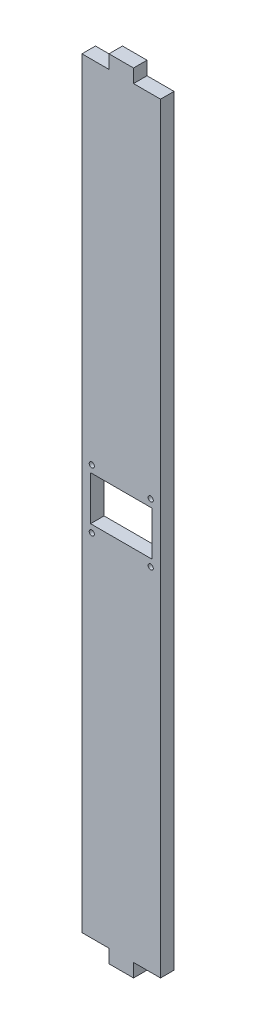
ISO-10303-21;
HEADER;
FILE_DESCRIPTION(('STEP AP214'),'2;1');
FILE_NAME('part.step','',(''),(''),'','','');
FILE_SCHEMA(('AUTOMOTIVE_DESIGN { 1 0 10303 214 1 1 1 1 }'));
ENDSEC;
DATA;
#1=APPLICATION_CONTEXT('core data for automotive mechanical design processes');
#2=APPLICATION_PROTOCOL_DEFINITION('international standard','automotive_design',2000,#1);
#3=PRODUCT_CONTEXT('',#1,'mechanical');
#4=PRODUCT('Part','Part','',(#3));
#5=PRODUCT_RELATED_PRODUCT_CATEGORY('part','',(#4));
#6=PRODUCT_DEFINITION_FORMATION('','',#4);
#7=PRODUCT_DEFINITION_CONTEXT('part definition',#1,'design');
#8=PRODUCT_DEFINITION('design','',#6,#7);
#9=PRODUCT_DEFINITION_SHAPE('','',#8);
#10=(LENGTH_UNIT() NAMED_UNIT(*) SI_UNIT(.MILLI.,.METRE.));
#11=(NAMED_UNIT(*) PLANE_ANGLE_UNIT() SI_UNIT($,.RADIAN.));
#12=(NAMED_UNIT(*) SI_UNIT($,.STERADIAN.) SOLID_ANGLE_UNIT());
#13=UNCERTAINTY_MEASURE_WITH_UNIT(LENGTH_MEASURE(1.E-05),#10,'distance_accuracy_value','');
#14=(GEOMETRIC_REPRESENTATION_CONTEXT(3) GLOBAL_UNCERTAINTY_ASSIGNED_CONTEXT((#13)) GLOBAL_UNIT_ASSIGNED_CONTEXT((#10,
#11,#12)) REPRESENTATION_CONTEXT('',''));
#15=CARTESIAN_POINT('',(0.,0.,0.));
#16=DIRECTION('',(0.,0.,1.));
#17=DIRECTION('',(1.,0.,0.));
#18=AXIS2_PLACEMENT_3D('',#15,#16,#17);
#19=CARTESIAN_POINT('',(16.,160.5,5.5));
#20=DIRECTION('',(-1.,0.,0.));
#21=DIRECTION('',(0.,-1.,0.));
#22=AXIS2_PLACEMENT_3D('',#19,#20,#21);
#23=PLANE('',#22);
#24=DIRECTION('',(0.,1.,0.));
#25=VECTOR('',#24,1.);
#26=CARTESIAN_POINT('',(16.,160.5,5.5));
#27=LINE('',#26,#25);
#28=CARTESIAN_POINT('',(16.,-155.,5.5));
#29=VERTEX_POINT('',#28);
#30=CARTESIAN_POINT('',(16.,155.,5.5));
#31=VERTEX_POINT('',#30);
#32=EDGE_CURVE('E185',#29,#31,#27,.T.);
#33=ORIENTED_EDGE('',*,*,#32,.F.);
#34=DIRECTION('',(0.,0.,1.));
#35=VECTOR('',#34,1.);
#36=CARTESIAN_POINT('',(16.,-155.,0.));
#37=LINE('',#36,#35);
#38=CARTESIAN_POINT('',(16.,-155.,0.));
#39=VERTEX_POINT('',#38);
#40=EDGE_CURVE('E274',#39,#29,#37,.T.);
#41=ORIENTED_EDGE('',*,*,#40,.F.);
#42=DIRECTION('',(0.,1.,0.));
#43=VECTOR('',#42,1.);
#44=CARTESIAN_POINT('',(16.,160.5,0.));
#45=LINE('',#44,#43);
#46=CARTESIAN_POINT('',(16.,155.,0.));
#47=VERTEX_POINT('',#46);
#48=EDGE_CURVE('E175',#39,#47,#45,.T.);
#49=ORIENTED_EDGE('',*,*,#48,.T.);
#50=DIRECTION('',(0.,0.,1.));
#51=VECTOR('',#50,1.);
#52=CARTESIAN_POINT('',(16.,155.,0.));
#53=LINE('',#52,#51);
#54=EDGE_CURVE('E255',#47,#31,#53,.T.);
#55=ORIENTED_EDGE('',*,*,#54,.T.);
#56=EDGE_LOOP('',(#33,#41,#49,#55));
#57=FACE_BOUND('',#56,.T.);
#58=ADVANCED_FACE('F33',(#57),#23,.F.);
#59=CARTESIAN_POINT('',(-16.,160.5,5.5));
#60=DIRECTION('',(0.,-1.,0.));
#61=DIRECTION('',(0.,0.,-1.));
#62=AXIS2_PLACEMENT_3D('',#59,#60,#61);
#63=PLANE('',#62);
#64=DIRECTION('',(-1.,0.,0.));
#65=VECTOR('',#64,1.);
#66=CARTESIAN_POINT('',(-16.,160.5,5.5));
#67=LINE('',#66,#65);
#68=CARTESIAN_POINT('',(4.99999999999999,160.5,5.5));
#69=VERTEX_POINT('',#68);
#70=CARTESIAN_POINT('',(-5.00000000000002,160.5,5.5));
#71=VERTEX_POINT('',#70);
#72=EDGE_CURVE('E167',#69,#71,#67,.T.);
#73=ORIENTED_EDGE('',*,*,#72,.F.);
#74=DIRECTION('',(0.,0.,1.));
#75=VECTOR('',#74,1.);
#76=CARTESIAN_POINT('',(4.99999999999999,160.5,0.));
#77=LINE('',#76,#75);
#78=CARTESIAN_POINT('',(4.99999999999999,160.5,0.));
#79=VERTEX_POINT('',#78);
#80=EDGE_CURVE('E151',#79,#69,#77,.T.);
#81=ORIENTED_EDGE('',*,*,#80,.F.);
#82=DIRECTION('',(-1.,0.,0.));
#83=VECTOR('',#82,1.);
#84=CARTESIAN_POINT('',(-16.,160.5,0.));
#85=LINE('',#84,#83);
#86=CARTESIAN_POINT('',(-5.00000000000002,160.5,0.));
#87=VERTEX_POINT('',#86);
#88=EDGE_CURVE('E165',#79,#87,#85,.T.);
#89=ORIENTED_EDGE('',*,*,#88,.T.);
#90=DIRECTION('',(0.,0.,1.));
#91=VECTOR('',#90,1.);
#92=CARTESIAN_POINT('',(-5.00000000000002,160.5,0.));
#93=LINE('',#92,#91);
#94=EDGE_CURVE('E224',#87,#71,#93,.T.);
#95=ORIENTED_EDGE('',*,*,#94,.T.);
#96=EDGE_LOOP('',(#73,#81,#89,#95));
#97=FACE_BOUND('',#96,.T.);
#98=ADVANCED_FACE('F163',(#97),#63,.F.);
#99=CARTESIAN_POINT('',(-16.,160.5,5.5));
#100=DIRECTION('',(1.,0.,0.));
#101=DIRECTION('',(0.,1.,0.));
#102=AXIS2_PLACEMENT_3D('',#99,#100,#101);
#103=PLANE('',#102);
#104=DIRECTION('',(0.,-1.,0.));
#105=VECTOR('',#104,1.);
#106=CARTESIAN_POINT('',(-16.,160.5,0.));
#107=LINE('',#106,#105);
#108=CARTESIAN_POINT('',(-16.,155.,0.));
#109=VERTEX_POINT('',#108);
#110=CARTESIAN_POINT('',(-16.,-155.,0.));
#111=VERTEX_POINT('',#110);
#112=EDGE_CURVE('E174',#109,#111,#107,.T.);
#113=ORIENTED_EDGE('',*,*,#112,.T.);
#114=DIRECTION('',(0.,0.,1.));
#115=VECTOR('',#114,1.);
#116=CARTESIAN_POINT('',(-16.,-155.,0.));
#117=LINE('',#116,#115);
#118=CARTESIAN_POINT('',(-16.,-155.,5.5));
#119=VERTEX_POINT('',#118);
#120=EDGE_CURVE('E262',#111,#119,#117,.T.);
#121=ORIENTED_EDGE('',*,*,#120,.T.);
#122=DIRECTION('',(0.,-1.,0.));
#123=VECTOR('',#122,1.);
#124=CARTESIAN_POINT('',(-16.,160.5,5.5));
#125=LINE('',#124,#123);
#126=CARTESIAN_POINT('',(-16.,155.,5.5));
#127=VERTEX_POINT('',#126);
#128=EDGE_CURVE('E41',#127,#119,#125,.T.);
#129=ORIENTED_EDGE('',*,*,#128,.F.);
#130=DIRECTION('',(0.,0.,1.));
#131=VECTOR('',#130,1.);
#132=CARTESIAN_POINT('',(-16.,155.,0.));
#133=LINE('',#132,#131);
#134=EDGE_CURVE('E244',#109,#127,#133,.T.);
#135=ORIENTED_EDGE('',*,*,#134,.F.);
#136=EDGE_LOOP('',(#113,#121,#129,#135));
#137=FACE_BOUND('',#136,.T.);
#138=ADVANCED_FACE('F323',(#137),#103,.F.);
#139=CARTESIAN_POINT('',(-16.,-160.5,5.5));
#140=DIRECTION('',(0.,1.,0.));
#141=DIRECTION('',(0.,0.,1.));
#142=AXIS2_PLACEMENT_3D('',#139,#140,#141);
#143=PLANE('',#142);
#144=DIRECTION('',(1.,0.,0.));
#145=VECTOR('',#144,1.);
#146=CARTESIAN_POINT('',(-16.,-160.5,5.5));
#147=LINE('',#146,#145);
#148=CARTESIAN_POINT('',(-5.00000000000002,-160.5,5.5));
#149=VERTEX_POINT('',#148);
#150=CARTESIAN_POINT('',(4.99999999999999,-160.5,5.5));
#151=VERTEX_POINT('',#150);
#152=EDGE_CURVE('E11',#149,#151,#147,.T.);
#153=ORIENTED_EDGE('',*,*,#152,.F.);
#154=DIRECTION('',(0.,0.,1.));
#155=VECTOR('',#154,1.);
#156=CARTESIAN_POINT('',(-5.00000000000002,-160.5,0.));
#157=LINE('',#156,#155);
#158=CARTESIAN_POINT('',(-5.00000000000002,-160.5,0.));
#159=VERTEX_POINT('',#158);
#160=EDGE_CURVE('E258',#159,#149,#157,.T.);
#161=ORIENTED_EDGE('',*,*,#160,.F.);
#162=DIRECTION('',(1.,0.,0.));
#163=VECTOR('',#162,1.);
#164=CARTESIAN_POINT('',(-16.,-160.5,0.));
#165=LINE('',#164,#163);
#166=CARTESIAN_POINT('',(4.99999999999999,-160.5,0.));
#167=VERTEX_POINT('',#166);
#168=EDGE_CURVE('E36',#159,#167,#165,.T.);
#169=ORIENTED_EDGE('',*,*,#168,.T.);
#170=DIRECTION('',(0.,0.,1.));
#171=VECTOR('',#170,1.);
#172=CARTESIAN_POINT('',(4.99999999999999,-160.5,0.));
#173=LINE('',#172,#171);
#174=EDGE_CURVE('E278',#167,#151,#173,.T.);
#175=ORIENTED_EDGE('',*,*,#174,.T.);
#176=EDGE_LOOP('',(#153,#161,#169,#175));
#177=FACE_BOUND('',#176,.T.);
#178=ADVANCED_FACE('F314',(#177),#143,.F.);
#179=CARTESIAN_POINT('',(0.,0.,5.5));
#180=DIRECTION('',(0.,0.,1.));
#181=DIRECTION('',(1.,0.,0.));
#182=AXIS2_PLACEMENT_3D('',#179,#180,#181);
#183=PLANE('',#182);
#184=DIRECTION('',(-1.,0.,0.));
#185=VECTOR('',#184,1.);
#186=CARTESIAN_POINT('',(-16.,-155.,5.5));
#187=LINE('',#186,#185);
#188=CARTESIAN_POINT('',(-5.00000000000002,-155.,5.5));
#189=VERTEX_POINT('',#188);
#190=EDGE_CURVE('E266',#189,#119,#187,.T.);
#191=ORIENTED_EDGE('',*,*,#190,.F.);
#192=DIRECTION('',(0.,1.,0.));
#193=VECTOR('',#192,1.);
#194=CARTESIAN_POINT('',(-5.00000000000002,-160.5,5.5));
#195=LINE('',#194,#193);
#196=EDGE_CURVE('E269',#149,#189,#195,.T.);
#197=ORIENTED_EDGE('',*,*,#196,.F.);
#198=ORIENTED_EDGE('',*,*,#152,.T.);
#199=DIRECTION('',(0.,-1.,0.));
#200=VECTOR('',#199,1.);
#201=CARTESIAN_POINT('',(4.99999999999999,-160.5,5.5));
#202=LINE('',#201,#200);
#203=CARTESIAN_POINT('',(4.99999999999999,-155.,5.5));
#204=VERTEX_POINT('',#203);
#205=EDGE_CURVE('E282',#204,#151,#202,.T.);
#206=ORIENTED_EDGE('',*,*,#205,.F.);
#207=DIRECTION('',(-1.,0.,0.));
#208=VECTOR('',#207,1.);
#209=CARTESIAN_POINT('',(16.,-155.,5.5));
#210=LINE('',#209,#208);
#211=EDGE_CURVE('E265',#29,#204,#210,.T.);
#212=ORIENTED_EDGE('',*,*,#211,.F.);
#213=ORIENTED_EDGE('',*,*,#32,.T.);
#214=DIRECTION('',(1.,0.,0.));
#215=VECTOR('',#214,1.);
#216=CARTESIAN_POINT('',(16.,155.,5.5));
#217=LINE('',#216,#215);
#218=CARTESIAN_POINT('',(4.99999999999999,155.,5.5));
#219=VERTEX_POINT('',#218);
#220=EDGE_CURVE('E158',#219,#31,#217,.T.);
#221=ORIENTED_EDGE('',*,*,#220,.F.);
#222=DIRECTION('',(0.,-1.,0.));
#223=VECTOR('',#222,1.);
#224=CARTESIAN_POINT('',(4.99999999999999,160.5,5.5));
#225=LINE('',#224,#223);
#226=EDGE_CURVE('E281',#69,#219,#225,.T.);
#227=ORIENTED_EDGE('',*,*,#226,.F.);
#228=ORIENTED_EDGE('',*,*,#72,.T.);
#229=DIRECTION('',(0.,1.,0.));
#230=VECTOR('',#229,1.);
#231=CARTESIAN_POINT('',(-5.00000000000002,160.5,5.5));
#232=LINE('',#231,#230);
#233=CARTESIAN_POINT('',(-5.00000000000002,155.,5.5));
#234=VERTEX_POINT('',#233);
#235=EDGE_CURVE('E249',#234,#71,#232,.T.);
#236=ORIENTED_EDGE('',*,*,#235,.F.);
#237=DIRECTION('',(1.,0.,0.));
#238=VECTOR('',#237,1.);
#239=CARTESIAN_POINT('',(-16.,155.,5.5));
#240=LINE('',#239,#238);
#241=EDGE_CURVE('E252',#127,#234,#240,.T.);
#242=ORIENTED_EDGE('',*,*,#241,.F.);
#243=ORIENTED_EDGE('',*,*,#128,.T.);
#244=EDGE_LOOP('',(#191,#197,#198,#206,#212,#213,#221,#227,#228,#236,#242,#243));
#245=FACE_BOUND('',#244,.T.);
#246=CARTESIAN_POINT('',(-12.,-12.,5.5));
#247=DIRECTION('',(0.,0.,1.));
#248=DIRECTION('',(1.,0.,0.));
#249=AXIS2_PLACEMENT_3D('',#246,#247,#248);
#250=CIRCLE('',#249,1.05);
#251=CARTESIAN_POINT('',(-10.95,-12.,5.5));
#252=VERTEX_POINT('',#251);
#253=EDGE_CURVE('E220',#252,#252,#250,.T.);
#254=ORIENTED_EDGE('',*,*,#253,.F.);
#255=EDGE_LOOP('',(#254));
#256=FACE_BOUND('',#255,.T.);
#257=CARTESIAN_POINT('',(-12.,12.,5.5));
#258=DIRECTION('',(0.,0.,1.));
#259=DIRECTION('',(1.,0.,0.));
#260=AXIS2_PLACEMENT_3D('',#257,#258,#259);
#261=CIRCLE('',#260,1.05);
#262=CARTESIAN_POINT('',(-10.95,12.,5.5));
#263=VERTEX_POINT('',#262);
#264=EDGE_CURVE('E227',#263,#263,#261,.T.);
#265=ORIENTED_EDGE('',*,*,#264,.F.);
#266=EDGE_LOOP('',(#265));
#267=FACE_BOUND('',#266,.T.);
#268=CARTESIAN_POINT('',(12.,-12.,5.5));
#269=DIRECTION('',(0.,0.,1.));
#270=DIRECTION('',(1.,0.,0.));
#271=AXIS2_PLACEMENT_3D('',#268,#269,#270);
#272=CIRCLE('',#271,1.05);
#273=CARTESIAN_POINT('',(13.05,-12.,5.5));
#274=VERTEX_POINT('',#273);
#275=EDGE_CURVE('E233',#274,#274,#272,.T.);
#276=ORIENTED_EDGE('',*,*,#275,.F.);
#277=EDGE_LOOP('',(#276));
#278=FACE_BOUND('',#277,.T.);
#279=CARTESIAN_POINT('',(12.,12.,5.5));
#280=DIRECTION('',(0.,0.,1.));
#281=DIRECTION('',(1.,0.,0.));
#282=AXIS2_PLACEMENT_3D('',#279,#280,#281);
#283=CIRCLE('',#282,1.05);
#284=CARTESIAN_POINT('',(13.05,12.,5.5));
#285=VERTEX_POINT('',#284);
#286=EDGE_CURVE('E239',#285,#285,#283,.T.);
#287=ORIENTED_EDGE('',*,*,#286,.F.);
#288=EDGE_LOOP('',(#287));
#289=FACE_BOUND('',#288,.T.);
#290=DIRECTION('',(0.,-1.,0.));
#291=VECTOR('',#290,1.);
#292=CARTESIAN_POINT('',(-12.5,9.,5.5));
#293=LINE('',#292,#291);
#294=CARTESIAN_POINT('',(-12.5,9.,5.5));
#295=VERTEX_POINT('',#294);
#296=CARTESIAN_POINT('',(-12.5,-9.,5.5));
#297=VERTEX_POINT('',#296);
#298=EDGE_CURVE('E207',#295,#297,#293,.T.);
#299=ORIENTED_EDGE('',*,*,#298,.F.);
#300=DIRECTION('',(-1.,0.,0.));
#301=VECTOR('',#300,1.);
#302=CARTESIAN_POINT('',(12.5,9.,5.5));
#303=LINE('',#302,#301);
#304=CARTESIAN_POINT('',(12.5,9.,5.5));
#305=VERTEX_POINT('',#304);
#306=EDGE_CURVE('E197',#305,#295,#303,.T.);
#307=ORIENTED_EDGE('',*,*,#306,.F.);
#308=DIRECTION('',(0.,1.,0.));
#309=VECTOR('',#308,1.);
#310=CARTESIAN_POINT('',(12.5,9.,5.5));
#311=LINE('',#310,#309);
#312=CARTESIAN_POINT('',(12.5,-9.,5.5));
#313=VERTEX_POINT('',#312);
#314=EDGE_CURVE('E201',#313,#305,#311,.T.);
#315=ORIENTED_EDGE('',*,*,#314,.F.);
#316=DIRECTION('',(1.,0.,0.));
#317=VECTOR('',#316,1.);
#318=CARTESIAN_POINT('',(12.5,-9.,5.5));
#319=LINE('',#318,#317);
#320=EDGE_CURVE('E204',#297,#313,#319,.T.);
#321=ORIENTED_EDGE('',*,*,#320,.F.);
#322=EDGE_LOOP('',(#299,#307,#315,#321));
#323=FACE_BOUND('',#322,.T.);
#324=ADVANCED_FACE('F306',(#245,#256,#267,#278,#289,#323),#183,.T.);
#325=CARTESIAN_POINT('',(0.,0.,0.));
#326=DIRECTION('',(0.,0.,1.));
#327=DIRECTION('',(1.,0.,0.));
#328=AXIS2_PLACEMENT_3D('',#325,#326,#327);
#329=PLANE('',#328);
#330=CARTESIAN_POINT('',(-12.,-12.,0.));
#331=DIRECTION('',(0.,0.,1.));
#332=DIRECTION('',(1.,0.,0.));
#333=AXIS2_PLACEMENT_3D('',#330,#331,#332);
#334=CIRCLE('',#333,1.05);
#335=CARTESIAN_POINT('',(-10.95,-12.,0.));
#336=VERTEX_POINT('',#335);
#337=EDGE_CURVE('E223',#336,#336,#334,.T.);
#338=ORIENTED_EDGE('',*,*,#337,.T.);
#339=EDGE_LOOP('',(#338));
#340=FACE_BOUND('',#339,.T.);
#341=CARTESIAN_POINT('',(-12.,12.,0.));
#342=DIRECTION('',(0.,0.,1.));
#343=DIRECTION('',(1.,0.,0.));
#344=AXIS2_PLACEMENT_3D('',#341,#342,#343);
#345=CIRCLE('',#344,1.05);
#346=CARTESIAN_POINT('',(-10.95,12.,0.));
#347=VERTEX_POINT('',#346);
#348=EDGE_CURVE('E230',#347,#347,#345,.T.);
#349=ORIENTED_EDGE('',*,*,#348,.T.);
#350=EDGE_LOOP('',(#349));
#351=FACE_BOUND('',#350,.T.);
#352=CARTESIAN_POINT('',(12.,-12.,0.));
#353=DIRECTION('',(0.,0.,1.));
#354=DIRECTION('',(1.,0.,0.));
#355=AXIS2_PLACEMENT_3D('',#352,#353,#354);
#356=CIRCLE('',#355,1.05);
#357=CARTESIAN_POINT('',(13.05,-12.,0.));
#358=VERTEX_POINT('',#357);
#359=EDGE_CURVE('E236',#358,#358,#356,.T.);
#360=ORIENTED_EDGE('',*,*,#359,.T.);
#361=EDGE_LOOP('',(#360));
#362=FACE_BOUND('',#361,.T.);
#363=CARTESIAN_POINT('',(12.,12.,0.));
#364=DIRECTION('',(0.,0.,1.));
#365=DIRECTION('',(1.,0.,0.));
#366=AXIS2_PLACEMENT_3D('',#363,#364,#365);
#367=CIRCLE('',#366,1.05);
#368=CARTESIAN_POINT('',(13.05,12.,0.));
#369=VERTEX_POINT('',#368);
#370=EDGE_CURVE('E209',#369,#369,#367,.T.);
#371=ORIENTED_EDGE('',*,*,#370,.T.);
#372=EDGE_LOOP('',(#371));
#373=FACE_BOUND('',#372,.T.);
#374=DIRECTION('',(-1.,0.,0.));
#375=VECTOR('',#374,1.);
#376=CARTESIAN_POINT('',(12.5,9.,0.));
#377=LINE('',#376,#375);
#378=CARTESIAN_POINT('',(12.5,9.,0.));
#379=VERTEX_POINT('',#378);
#380=CARTESIAN_POINT('',(-12.5,9.,0.));
#381=VERTEX_POINT('',#380);
#382=EDGE_CURVE('E192',#379,#381,#377,.T.);
#383=ORIENTED_EDGE('',*,*,#382,.T.);
#384=DIRECTION('',(0.,-1.,0.));
#385=VECTOR('',#384,1.);
#386=CARTESIAN_POINT('',(-12.5,9.,0.));
#387=LINE('',#386,#385);
#388=CARTESIAN_POINT('',(-12.5,-9.,0.));
#389=VERTEX_POINT('',#388);
#390=EDGE_CURVE('E200',#381,#389,#387,.T.);
#391=ORIENTED_EDGE('',*,*,#390,.T.);
#392=DIRECTION('',(1.,0.,0.));
#393=VECTOR('',#392,1.);
#394=CARTESIAN_POINT('',(12.5,-9.,0.));
#395=LINE('',#394,#393);
#396=CARTESIAN_POINT('',(12.5,-9.,0.));
#397=VERTEX_POINT('',#396);
#398=EDGE_CURVE('E215',#389,#397,#395,.T.);
#399=ORIENTED_EDGE('',*,*,#398,.T.);
#400=DIRECTION('',(0.,1.,0.));
#401=VECTOR('',#400,1.);
#402=CARTESIAN_POINT('',(12.5,9.,0.));
#403=LINE('',#402,#401);
#404=EDGE_CURVE('E212',#397,#379,#403,.T.);
#405=ORIENTED_EDGE('',*,*,#404,.T.);
#406=EDGE_LOOP('',(#383,#391,#399,#405));
#407=FACE_BOUND('',#406,.T.);
#408=DIRECTION('',(0.,1.,0.));
#409=VECTOR('',#408,1.);
#410=CARTESIAN_POINT('',(-5.00000000000002,-160.5,0.));
#411=LINE('',#410,#409);
#412=CARTESIAN_POINT('',(-5.00000000000002,-155.,0.));
#413=VERTEX_POINT('',#412);
#414=EDGE_CURVE('E268',#159,#413,#411,.T.);
#415=ORIENTED_EDGE('',*,*,#414,.T.);
#416=DIRECTION('',(-1.,0.,0.));
#417=VECTOR('',#416,1.);
#418=CARTESIAN_POINT('',(-16.,-155.,0.));
#419=LINE('',#418,#417);
#420=EDGE_CURVE('E49',#413,#111,#419,.T.);
#421=ORIENTED_EDGE('',*,*,#420,.T.);
#422=ORIENTED_EDGE('',*,*,#112,.F.);
#423=DIRECTION('',(1.,0.,0.));
#424=VECTOR('',#423,1.);
#425=CARTESIAN_POINT('',(-16.,155.,0.));
#426=LINE('',#425,#424);
#427=CARTESIAN_POINT('',(-5.00000000000002,155.,0.));
#428=VERTEX_POINT('',#427);
#429=EDGE_CURVE('E251',#109,#428,#426,.T.);
#430=ORIENTED_EDGE('',*,*,#429,.T.);
#431=DIRECTION('',(0.,1.,0.));
#432=VECTOR('',#431,1.);
#433=CARTESIAN_POINT('',(-5.00000000000002,160.5,0.));
#434=LINE('',#433,#432);
#435=EDGE_CURVE('E173',#428,#87,#434,.T.);
#436=ORIENTED_EDGE('',*,*,#435,.T.);
#437=ORIENTED_EDGE('',*,*,#88,.F.);
#438=DIRECTION('',(0.,-1.,0.));
#439=VECTOR('',#438,1.);
#440=CARTESIAN_POINT('',(4.99999999999999,160.5,0.));
#441=LINE('',#440,#439);
#442=CARTESIAN_POINT('',(4.99999999999999,155.,0.));
#443=VERTEX_POINT('',#442);
#444=EDGE_CURVE('E147',#79,#443,#441,.T.);
#445=ORIENTED_EDGE('',*,*,#444,.T.);
#446=DIRECTION('',(1.,0.,0.));
#447=VECTOR('',#446,1.);
#448=CARTESIAN_POINT('',(16.,155.,0.));
#449=LINE('',#448,#447);
#450=EDGE_CURVE('E157',#443,#47,#449,.T.);
#451=ORIENTED_EDGE('',*,*,#450,.T.);
#452=ORIENTED_EDGE('',*,*,#48,.F.);
#453=DIRECTION('',(-1.,0.,0.));
#454=VECTOR('',#453,1.);
#455=CARTESIAN_POINT('',(16.,-155.,0.));
#456=LINE('',#455,#454);
#457=CARTESIAN_POINT('',(4.99999999999999,-155.,0.));
#458=VERTEX_POINT('',#457);
#459=EDGE_CURVE('E284',#39,#458,#456,.T.);
#460=ORIENTED_EDGE('',*,*,#459,.T.);
#461=DIRECTION('',(0.,-1.,0.));
#462=VECTOR('',#461,1.);
#463=CARTESIAN_POINT('',(4.99999999999999,-160.5,0.));
#464=LINE('',#463,#462);
#465=EDGE_CURVE('E57',#458,#167,#464,.T.);
#466=ORIENTED_EDGE('',*,*,#465,.T.);
#467=ORIENTED_EDGE('',*,*,#168,.F.);
#468=EDGE_LOOP('',(#415,#421,#422,#430,#436,#437,#445,#451,#452,#460,#466,#467));
#469=FACE_BOUND('',#468,.T.);
#470=ADVANCED_FACE('F171',(#340,#351,#362,#373,#407,#469),#329,.F.);
#471=CARTESIAN_POINT('',(-12.5,9.,0.));
#472=DIRECTION('',(-1.,0.,0.));
#473=DIRECTION('',(0.,-1.,0.));
#474=AXIS2_PLACEMENT_3D('',#471,#472,#473);
#475=PLANE('',#474);
#476=ORIENTED_EDGE('',*,*,#298,.T.);
#477=DIRECTION('',(0.,0.,1.));
#478=VECTOR('',#477,1.);
#479=CARTESIAN_POINT('',(-12.5,-9.,0.));
#480=LINE('',#479,#478);
#481=EDGE_CURVE('E188',#389,#297,#480,.T.);
#482=ORIENTED_EDGE('',*,*,#481,.F.);
#483=ORIENTED_EDGE('',*,*,#390,.F.);
#484=DIRECTION('',(0.,0.,1.));
#485=VECTOR('',#484,1.);
#486=CARTESIAN_POINT('',(-12.5,9.,0.));
#487=LINE('',#486,#485);
#488=EDGE_CURVE('E179',#381,#295,#487,.T.);
#489=ORIENTED_EDGE('',*,*,#488,.T.);
#490=EDGE_LOOP('',(#476,#482,#483,#489));
#491=FACE_BOUND('',#490,.T.);
#492=ADVANCED_FACE('F355',(#491),#475,.F.);
#493=CARTESIAN_POINT('',(12.5,9.,0.));
#494=DIRECTION('',(0.,1.,0.));
#495=DIRECTION('',(-1.,0.,0.));
#496=AXIS2_PLACEMENT_3D('',#493,#494,#495);
#497=PLANE('',#496);
#498=ORIENTED_EDGE('',*,*,#306,.T.);
#499=ORIENTED_EDGE('',*,*,#488,.F.);
#500=ORIENTED_EDGE('',*,*,#382,.F.);
#501=DIRECTION('',(0.,0.,1.));
#502=VECTOR('',#501,1.);
#503=CARTESIAN_POINT('',(12.5,9.,0.));
#504=LINE('',#503,#502);
#505=EDGE_CURVE('E194',#379,#305,#504,.T.);
#506=ORIENTED_EDGE('',*,*,#505,.T.);
#507=EDGE_LOOP('',(#498,#499,#500,#506));
#508=FACE_BOUND('',#507,.T.);
#509=ADVANCED_FACE('F361',(#508),#497,.F.);
#510=CARTESIAN_POINT('',(12.5,9.,0.));
#511=DIRECTION('',(1.,0.,0.));
#512=DIRECTION('',(0.,1.,0.));
#513=AXIS2_PLACEMENT_3D('',#510,#511,#512);
#514=PLANE('',#513);
#515=ORIENTED_EDGE('',*,*,#314,.T.);
#516=ORIENTED_EDGE('',*,*,#505,.F.);
#517=ORIENTED_EDGE('',*,*,#404,.F.);
#518=DIRECTION('',(0.,0.,1.));
#519=VECTOR('',#518,1.);
#520=CARTESIAN_POINT('',(12.5,-9.,0.));
#521=LINE('',#520,#519);
#522=EDGE_CURVE('E191',#397,#313,#521,.T.);
#523=ORIENTED_EDGE('',*,*,#522,.T.);
#524=EDGE_LOOP('',(#515,#516,#517,#523));
#525=FACE_BOUND('',#524,.T.);
#526=ADVANCED_FACE('F367',(#525),#514,.F.);
#527=CARTESIAN_POINT('',(12.5,-9.,0.));
#528=DIRECTION('',(0.,-1.,0.));
#529=DIRECTION('',(1.,0.,0.));
#530=AXIS2_PLACEMENT_3D('',#527,#528,#529);
#531=PLANE('',#530);
#532=ORIENTED_EDGE('',*,*,#320,.T.);
#533=ORIENTED_EDGE('',*,*,#522,.F.);
#534=ORIENTED_EDGE('',*,*,#398,.F.);
#535=ORIENTED_EDGE('',*,*,#481,.T.);
#536=EDGE_LOOP('',(#532,#533,#534,#535));
#537=FACE_BOUND('',#536,.T.);
#538=ADVANCED_FACE('F363',(#537),#531,.F.);
#539=CARTESIAN_POINT('',(12.,12.,0.));
#540=DIRECTION('',(0.,0.,1.));
#541=DIRECTION('',(1.,0.,0.));
#542=AXIS2_PLACEMENT_3D('',#539,#540,#541);
#543=CYLINDRICAL_SURFACE('',#542,1.05);
#544=ORIENTED_EDGE('',*,*,#370,.F.);
#545=EDGE_LOOP('',(#544));
#546=FACE_BOUND('',#545,.T.);
#547=ORIENTED_EDGE('',*,*,#286,.T.);
#548=EDGE_LOOP('',(#547));
#549=FACE_BOUND('',#548,.T.);
#550=ADVANCED_FACE('F366',(#546,#549),#543,.F.);
#551=CARTESIAN_POINT('',(12.,-12.,0.));
#552=DIRECTION('',(0.,0.,1.));
#553=DIRECTION('',(1.,0.,0.));
#554=AXIS2_PLACEMENT_3D('',#551,#552,#553);
#555=CYLINDRICAL_SURFACE('',#554,1.05);
#556=ORIENTED_EDGE('',*,*,#359,.F.);
#557=EDGE_LOOP('',(#556));
#558=FACE_BOUND('',#557,.T.);
#559=ORIENTED_EDGE('',*,*,#275,.T.);
#560=EDGE_LOOP('',(#559));
#561=FACE_BOUND('',#560,.T.);
#562=ADVANCED_FACE('F382',(#558,#561),#555,.F.);
#563=CARTESIAN_POINT('',(-12.,12.,0.));
#564=DIRECTION('',(0.,0.,1.));
#565=DIRECTION('',(1.,0.,0.));
#566=AXIS2_PLACEMENT_3D('',#563,#564,#565);
#567=CYLINDRICAL_SURFACE('',#566,1.05);
#568=ORIENTED_EDGE('',*,*,#348,.F.);
#569=EDGE_LOOP('',(#568));
#570=FACE_BOUND('',#569,.T.);
#571=ORIENTED_EDGE('',*,*,#264,.T.);
#572=EDGE_LOOP('',(#571));
#573=FACE_BOUND('',#572,.T.);
#574=ADVANCED_FACE('F378',(#570,#573),#567,.F.);
#575=CARTESIAN_POINT('',(-12.,-12.,0.));
#576=DIRECTION('',(0.,0.,1.));
#577=DIRECTION('',(1.,0.,0.));
#578=AXIS2_PLACEMENT_3D('',#575,#576,#577);
#579=CYLINDRICAL_SURFACE('',#578,1.05);
#580=ORIENTED_EDGE('',*,*,#337,.F.);
#581=EDGE_LOOP('',(#580));
#582=FACE_BOUND('',#581,.T.);
#583=ORIENTED_EDGE('',*,*,#253,.T.);
#584=EDGE_LOOP('',(#583));
#585=FACE_BOUND('',#584,.T.);
#586=ADVANCED_FACE('F375',(#582,#585),#579,.F.);
#587=CARTESIAN_POINT('',(-5.00000000000002,160.5,0.));
#588=DIRECTION('',(1.,0.,0.));
#589=DIRECTION('',(0.,0.,-1.));
#590=AXIS2_PLACEMENT_3D('',#587,#588,#589);
#591=PLANE('',#590);
#592=ORIENTED_EDGE('',*,*,#235,.T.);
#593=ORIENTED_EDGE('',*,*,#94,.F.);
#594=ORIENTED_EDGE('',*,*,#435,.F.);
#595=DIRECTION('',(0.,0.,1.));
#596=VECTOR('',#595,1.);
#597=CARTESIAN_POINT('',(-5.00000000000002,155.,0.));
#598=LINE('',#597,#596);
#599=EDGE_CURVE('E246',#428,#234,#598,.T.);
#600=ORIENTED_EDGE('',*,*,#599,.T.);
#601=EDGE_LOOP('',(#592,#593,#594,#600));
#602=FACE_BOUND('',#601,.T.);
#603=ADVANCED_FACE('F331',(#602),#591,.F.);
#604=CARTESIAN_POINT('',(-16.,155.,0.));
#605=DIRECTION('',(0.,-1.,0.));
#606=DIRECTION('',(0.,0.,-1.));
#607=AXIS2_PLACEMENT_3D('',#604,#605,#606);
#608=PLANE('',#607);
#609=ORIENTED_EDGE('',*,*,#241,.T.);
#610=ORIENTED_EDGE('',*,*,#599,.F.);
#611=ORIENTED_EDGE('',*,*,#429,.F.);
#612=ORIENTED_EDGE('',*,*,#134,.T.);
#613=EDGE_LOOP('',(#609,#610,#611,#612));
#614=FACE_BOUND('',#613,.T.);
#615=ADVANCED_FACE('F329',(#614),#608,.F.);
#616=CARTESIAN_POINT('',(16.,155.,0.));
#617=DIRECTION('',(0.,-1.,0.));
#618=DIRECTION('',(0.,0.,-1.));
#619=AXIS2_PLACEMENT_3D('',#616,#617,#618);
#620=PLANE('',#619);
#621=ORIENTED_EDGE('',*,*,#220,.T.);
#622=ORIENTED_EDGE('',*,*,#54,.F.);
#623=ORIENTED_EDGE('',*,*,#450,.F.);
#624=DIRECTION('',(0.,0.,1.));
#625=VECTOR('',#624,1.);
#626=CARTESIAN_POINT('',(4.99999999999999,155.,0.));
#627=LINE('',#626,#625);
#628=EDGE_CURVE('E153',#443,#219,#627,.T.);
#629=ORIENTED_EDGE('',*,*,#628,.T.);
#630=EDGE_LOOP('',(#621,#622,#623,#629));
#631=FACE_BOUND('',#630,.T.);
#632=ADVANCED_FACE('F332',(#631),#620,.F.);
#633=CARTESIAN_POINT('',(4.99999999999999,160.5,0.));
#634=DIRECTION('',(-1.,0.,0.));
#635=DIRECTION('',(0.,-1.,0.));
#636=AXIS2_PLACEMENT_3D('',#633,#634,#635);
#637=PLANE('',#636);
#638=ORIENTED_EDGE('',*,*,#226,.T.);
#639=ORIENTED_EDGE('',*,*,#628,.F.);
#640=ORIENTED_EDGE('',*,*,#444,.F.);
#641=ORIENTED_EDGE('',*,*,#80,.T.);
#642=EDGE_LOOP('',(#638,#639,#640,#641));
#643=FACE_BOUND('',#642,.T.);
#644=ADVANCED_FACE('F150',(#643),#637,.F.);
#645=CARTESIAN_POINT('',(4.99999999999999,-160.5,0.));
#646=DIRECTION('',(-1.,0.,0.));
#647=DIRECTION('',(0.,-1.,0.));
#648=AXIS2_PLACEMENT_3D('',#645,#646,#647);
#649=PLANE('',#648);
#650=ORIENTED_EDGE('',*,*,#205,.T.);
#651=ORIENTED_EDGE('',*,*,#174,.F.);
#652=ORIENTED_EDGE('',*,*,#465,.F.);
#653=DIRECTION('',(0.,0.,1.));
#654=VECTOR('',#653,1.);
#655=CARTESIAN_POINT('',(4.99999999999999,-155.,0.));
#656=LINE('',#655,#654);
#657=EDGE_CURVE('E276',#458,#204,#656,.T.);
#658=ORIENTED_EDGE('',*,*,#657,.T.);
#659=EDGE_LOOP('',(#650,#651,#652,#658));
#660=FACE_BOUND('',#659,.T.);
#661=ADVANCED_FACE('F311',(#660),#649,.F.);
#662=CARTESIAN_POINT('',(16.,-155.,0.));
#663=DIRECTION('',(0.,1.,0.));
#664=DIRECTION('',(0.,0.,1.));
#665=AXIS2_PLACEMENT_3D('',#662,#663,#664);
#666=PLANE('',#665);
#667=ORIENTED_EDGE('',*,*,#211,.T.);
#668=ORIENTED_EDGE('',*,*,#657,.F.);
#669=ORIENTED_EDGE('',*,*,#459,.F.);
#670=ORIENTED_EDGE('',*,*,#40,.T.);
#671=EDGE_LOOP('',(#667,#668,#669,#670));
#672=FACE_BOUND('',#671,.T.);
#673=ADVANCED_FACE('F302',(#672),#666,.F.);
#674=CARTESIAN_POINT('',(-16.,-155.,0.));
#675=DIRECTION('',(0.,1.,0.));
#676=DIRECTION('',(0.,0.,1.));
#677=AXIS2_PLACEMENT_3D('',#674,#675,#676);
#678=PLANE('',#677);
#679=ORIENTED_EDGE('',*,*,#190,.T.);
#680=ORIENTED_EDGE('',*,*,#120,.F.);
#681=ORIENTED_EDGE('',*,*,#420,.F.);
#682=DIRECTION('',(0.,0.,1.));
#683=VECTOR('',#682,1.);
#684=CARTESIAN_POINT('',(-5.00000000000002,-155.,0.));
#685=LINE('',#684,#683);
#686=EDGE_CURVE('E260',#413,#189,#685,.T.);
#687=ORIENTED_EDGE('',*,*,#686,.T.);
#688=EDGE_LOOP('',(#679,#680,#681,#687));
#689=FACE_BOUND('',#688,.T.);
#690=ADVANCED_FACE('F320',(#689),#678,.F.);
#691=CARTESIAN_POINT('',(-5.00000000000002,-160.5,0.));
#692=DIRECTION('',(1.,0.,0.));
#693=DIRECTION('',(0.,0.,-1.));
#694=AXIS2_PLACEMENT_3D('',#691,#692,#693);
#695=PLANE('',#694);
#696=ORIENTED_EDGE('',*,*,#196,.T.);
#697=ORIENTED_EDGE('',*,*,#686,.F.);
#698=ORIENTED_EDGE('',*,*,#414,.F.);
#699=ORIENTED_EDGE('',*,*,#160,.T.);
#700=EDGE_LOOP('',(#696,#697,#698,#699));
#701=FACE_BOUND('',#700,.T.);
#702=ADVANCED_FACE('F319',(#701),#695,.F.);
#703=CLOSED_SHELL('',(#58,#98,#138,#178,#324,#470,#492,#509,#526,#538,#550,#562,#574,#586,#603,
#615,#632,#644,#661,#673,#690,#702));
#704=MANIFOLD_SOLID_BREP('B2',#703);
#705=ADVANCED_BREP_SHAPE_REPRESENTATION('',(#18,#704),#14);
#706=SHAPE_DEFINITION_REPRESENTATION(#9,#705);
ENDSEC;
END-ISO-10303-21;
